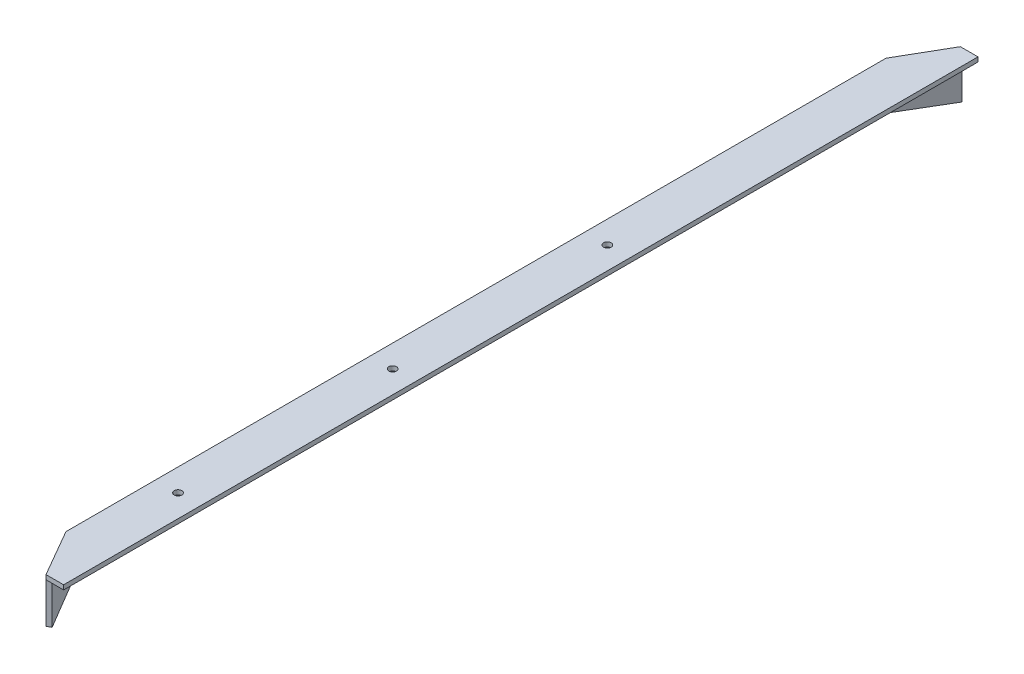
ISO-10303-21;
HEADER;
FILE_DESCRIPTION(('STEP AP214'),'2;1');
FILE_NAME('part.step','',(''),(''),'','','');
FILE_SCHEMA(('AUTOMOTIVE_DESIGN { 1 0 10303 214 1 1 1 1 }'));
ENDSEC;
DATA;
#1=APPLICATION_CONTEXT('core data for automotive mechanical design processes');
#2=APPLICATION_PROTOCOL_DEFINITION('international standard','automotive_design',2000,#1);
#3=PRODUCT_CONTEXT('',#1,'mechanical');
#4=PRODUCT('Part','Part','',(#3));
#5=PRODUCT_RELATED_PRODUCT_CATEGORY('part','',(#4));
#6=PRODUCT_DEFINITION_FORMATION('','',#4);
#7=PRODUCT_DEFINITION_CONTEXT('part definition',#1,'design');
#8=PRODUCT_DEFINITION('design','',#6,#7);
#9=PRODUCT_DEFINITION_SHAPE('','',#8);
#10=(LENGTH_UNIT() NAMED_UNIT(*) SI_UNIT(.MILLI.,.METRE.));
#11=(NAMED_UNIT(*) PLANE_ANGLE_UNIT() SI_UNIT($,.RADIAN.));
#12=(NAMED_UNIT(*) SI_UNIT($,.STERADIAN.) SOLID_ANGLE_UNIT());
#13=UNCERTAINTY_MEASURE_WITH_UNIT(LENGTH_MEASURE(1.E-05),#10,'distance_accuracy_value','');
#14=(GEOMETRIC_REPRESENTATION_CONTEXT(3) GLOBAL_UNCERTAINTY_ASSIGNED_CONTEXT((#13)) GLOBAL_UNIT_ASSIGNED_CONTEXT((#10,
#11,#12)) REPRESENTATION_CONTEXT('',''));
#15=CARTESIAN_POINT('',(0.,0.,0.));
#16=DIRECTION('',(0.,0.,1.));
#17=DIRECTION('',(1.,0.,0.));
#18=AXIS2_PLACEMENT_3D('',#15,#16,#17);
#19=CARTESIAN_POINT('',(7.,0.,640.));
#20=DIRECTION('',(0.,1.,0.));
#21=DIRECTION('',(-1.,0.,0.));
#22=AXIS2_PLACEMENT_3D('',#19,#20,#21);
#23=PLANE('',#22);
#24=DIRECTION('',(0.,0.,-1.));
#25=VECTOR('',#24,1.);
#26=CARTESIAN_POINT('',(0.,0.,640.));
#27=LINE('',#26,#25);
#28=CARTESIAN_POINT('',(0.,0.,640.));
#29=VERTEX_POINT('',#28);
#30=CARTESIAN_POINT('',(0.,0.,-640.));
#31=VERTEX_POINT('',#30);
#32=EDGE_CURVE('E246',#29,#31,#27,.T.);
#33=ORIENTED_EDGE('',*,*,#32,.T.);
#34=DIRECTION('',(0.5,0.,-0.866025403784439));
#35=VECTOR('',#34,1.);
#36=CARTESIAN_POINT('',(0.,0.,-640.));
#37=LINE('',#36,#35);
#38=CARTESIAN_POINT('',(42.5,0.,-713.612159321677));
#39=VERTEX_POINT('',#38);
#40=EDGE_CURVE('E142',#31,#39,#37,.T.);
#41=ORIENTED_EDGE('',*,*,#40,.T.);
#42=DIRECTION('',(0.866025403784443,0.,0.499999999999992));
#43=VECTOR('',#42,1.);
#44=CARTESIAN_POINT('',(42.5,0.,-713.612159321677));
#45=LINE('',#44,#43);
#46=CARTESIAN_POINT('',(48.5621778264911,0.,-710.112159321677));
#47=VERTEX_POINT('',#46);
#48=EDGE_CURVE('E178',#39,#47,#45,.T.);
#49=ORIENTED_EDGE('',*,*,#48,.T.);
#50=DIRECTION('',(-0.509931612811304,0.,0.860214944217817));
#51=VECTOR('',#50,1.);
#52=CARTESIAN_POINT('',(48.5621778264911,0.,-710.112159321677));
#53=LINE('',#52,#51);
#54=CARTESIAN_POINT('',(7.,0.,-640.));
#55=VERTEX_POINT('',#54);
#56=EDGE_CURVE('E170',#47,#55,#53,.T.);
#57=ORIENTED_EDGE('',*,*,#56,.T.);
#58=DIRECTION('',(0.,0.,-1.));
#59=VECTOR('',#58,1.);
#60=CARTESIAN_POINT('',(7.,0.,640.));
#61=LINE('',#60,#59);
#62=CARTESIAN_POINT('',(7.,0.,640.));
#63=VERTEX_POINT('',#62);
#64=EDGE_CURVE('E11',#63,#55,#61,.T.);
#65=ORIENTED_EDGE('',*,*,#64,.F.);
#66=DIRECTION('',(-0.509931612811304,0.,-0.860214944217817));
#67=VECTOR('',#66,1.);
#68=CARTESIAN_POINT('',(48.5621778264911,0.,710.112159321677));
#69=LINE('',#68,#67);
#70=CARTESIAN_POINT('',(48.5621778264911,0.,710.112159321677));
#71=VERTEX_POINT('',#70);
#72=EDGE_CURVE('E220',#71,#63,#69,.T.);
#73=ORIENTED_EDGE('',*,*,#72,.F.);
#74=DIRECTION('',(0.866025403784443,0.,-0.499999999999992));
#75=VECTOR('',#74,1.);
#76=CARTESIAN_POINT('',(42.5,0.,713.612159321677));
#77=LINE('',#76,#75);
#78=CARTESIAN_POINT('',(42.5,0.,713.612159321677));
#79=VERTEX_POINT('',#78);
#80=EDGE_CURVE('E227',#79,#71,#77,.T.);
#81=ORIENTED_EDGE('',*,*,#80,.F.);
#82=DIRECTION('',(0.5,0.,0.866025403784439));
#83=VECTOR('',#82,1.);
#84=CARTESIAN_POINT('',(0.,0.,640.));
#85=LINE('',#84,#83);
#86=EDGE_CURVE('E214',#29,#79,#85,.T.);
#87=ORIENTED_EDGE('',*,*,#86,.F.);
#88=EDGE_LOOP('',(#33,#41,#49,#57,#65,#73,#81,#87));
#89=FACE_BOUND('',#88,.T.);
#90=ADVANCED_FACE('F45',(#89),#23,.F.);
#91=CARTESIAN_POINT('',(6.99999999999999,63.,640.));
#92=DIRECTION('',(-1.,0.,0.));
#93=DIRECTION('',(0.,-1.,0.));
#94=AXIS2_PLACEMENT_3D('',#91,#92,#93);
#95=PLANE('',#94);
#96=ORIENTED_EDGE('',*,*,#64,.T.);
#97=DIRECTION('',(0.,1.,0.));
#98=VECTOR('',#97,1.);
#99=CARTESIAN_POINT('',(6.99999999999999,63.,-640.));
#100=LINE('',#99,#98);
#101=CARTESIAN_POINT('',(6.99999999999999,63.,-640.));
#102=VERTEX_POINT('',#101);
#103=EDGE_CURVE('E190',#55,#102,#100,.T.);
#104=ORIENTED_EDGE('',*,*,#103,.T.);
#105=DIRECTION('',(0.,0.,-1.));
#106=VECTOR('',#105,1.);
#107=CARTESIAN_POINT('',(6.99999999999999,63.,640.));
#108=LINE('',#107,#106);
#109=CARTESIAN_POINT('',(6.99999999999999,63.,640.));
#110=VERTEX_POINT('',#109);
#111=EDGE_CURVE('E54',#110,#102,#108,.T.);
#112=ORIENTED_EDGE('',*,*,#111,.F.);
#113=DIRECTION('',(0.,1.,0.));
#114=VECTOR('',#113,1.);
#115=CARTESIAN_POINT('',(6.99999999999999,63.,640.));
#116=LINE('',#115,#114);
#117=EDGE_CURVE('E240',#63,#110,#116,.T.);
#118=ORIENTED_EDGE('',*,*,#117,.F.);
#119=EDGE_LOOP('',(#96,#104,#112,#118));
#120=FACE_BOUND('',#119,.T.);
#121=ADVANCED_FACE('F306',(#120),#95,.F.);
#122=CARTESIAN_POINT('',(70.,63.,640.));
#123=DIRECTION('',(0.,1.,0.));
#124=DIRECTION('',(-1.,0.,0.));
#125=AXIS2_PLACEMENT_3D('',#122,#123,#124);
#126=PLANE('',#125);
#127=CARTESIAN_POINT('',(35.,63.,500.));
#128=DIRECTION('',(0.,1.,0.));
#129=DIRECTION('',(-1.,0.,0.));
#130=AXIS2_PLACEMENT_3D('',#127,#128,#129);
#131=CIRCLE('',#130,6.);
#132=CARTESIAN_POINT('',(29.,63.,500.));
#133=VERTEX_POINT('',#132);
#134=EDGE_CURVE('E163',#133,#133,#131,.F.);
#135=ORIENTED_EDGE('',*,*,#134,.F.);
#136=EDGE_LOOP('',(#135));
#137=FACE_BOUND('',#136,.T.);
#138=CARTESIAN_POINT('',(35.,63.,165.));
#139=DIRECTION('',(0.,1.,0.));
#140=DIRECTION('',(-1.,0.,0.));
#141=AXIS2_PLACEMENT_3D('',#138,#139,#140);
#142=CIRCLE('',#141,6.);
#143=CARTESIAN_POINT('',(29.,63.,165.));
#144=VERTEX_POINT('',#143);
#145=EDGE_CURVE('E265',#144,#144,#142,.F.);
#146=ORIENTED_EDGE('',*,*,#145,.F.);
#147=EDGE_LOOP('',(#146));
#148=FACE_BOUND('',#147,.T.);
#149=CARTESIAN_POINT('',(35.,63.,-170.));
#150=DIRECTION('',(0.,1.,0.));
#151=DIRECTION('',(-1.,0.,0.));
#152=AXIS2_PLACEMENT_3D('',#149,#150,#151);
#153=CIRCLE('',#152,6.);
#154=CARTESIAN_POINT('',(29.,63.,-170.));
#155=VERTEX_POINT('',#154);
#156=EDGE_CURVE('E261',#155,#155,#153,.F.);
#157=ORIENTED_EDGE('',*,*,#156,.F.);
#158=EDGE_LOOP('',(#157));
#159=FACE_BOUND('',#158,.T.);
#160=ORIENTED_EDGE('',*,*,#111,.T.);
#161=DIRECTION('',(-0.509931612811304,0.,0.860214944217817));
#162=VECTOR('',#161,1.);
#163=CARTESIAN_POINT('',(48.5621778264911,63.,-710.112159321677));
#164=LINE('',#163,#162);
#165=CARTESIAN_POINT('',(48.5621778264911,63.,-710.112159321677));
#166=VERTEX_POINT('',#165);
#167=EDGE_CURVE('E169',#166,#102,#164,.T.);
#168=ORIENTED_EDGE('',*,*,#167,.F.);
#169=DIRECTION('',(0.866025403784443,0.,0.499999999999992));
#170=VECTOR('',#169,1.);
#171=CARTESIAN_POINT('',(42.5,63.,-713.612159321677));
#172=LINE('',#171,#170);
#173=CARTESIAN_POINT('',(42.5,63.,-713.612159321677));
#174=VERTEX_POINT('',#173);
#175=EDGE_CURVE('E165',#174,#166,#172,.T.);
#176=ORIENTED_EDGE('',*,*,#175,.F.);
#177=DIRECTION('',(1.,0.,0.));
#178=VECTOR('',#177,1.);
#179=CARTESIAN_POINT('',(42.5,63.,-713.612159321677));
#180=LINE('',#179,#178);
#181=CARTESIAN_POINT('',(70.,63.,-713.612159321677));
#182=VERTEX_POINT('',#181);
#183=EDGE_CURVE('E138',#174,#182,#180,.T.);
#184=ORIENTED_EDGE('',*,*,#183,.T.);
#185=DIRECTION('',(0.,0.,-1.));
#186=VECTOR('',#185,1.);
#187=CARTESIAN_POINT('',(70.,63.,640.));
#188=LINE('',#187,#186);
#189=CARTESIAN_POINT('',(70.,63.,713.612159321677));
#190=VERTEX_POINT('',#189);
#191=EDGE_CURVE('E253',#190,#182,#188,.T.);
#192=ORIENTED_EDGE('',*,*,#191,.F.);
#193=DIRECTION('',(1.,0.,0.));
#194=VECTOR('',#193,1.);
#195=CARTESIAN_POINT('',(42.5,63.,713.612159321677));
#196=LINE('',#195,#194);
#197=CARTESIAN_POINT('',(42.5,63.,713.612159321677));
#198=VERTEX_POINT('',#197);
#199=EDGE_CURVE('E196',#198,#190,#196,.T.);
#200=ORIENTED_EDGE('',*,*,#199,.F.);
#201=DIRECTION('',(0.866025403784443,0.,-0.499999999999992));
#202=VECTOR('',#201,1.);
#203=CARTESIAN_POINT('',(42.5,63.,713.612159321677));
#204=LINE('',#203,#202);
#205=CARTESIAN_POINT('',(48.5621778264911,63.,710.112159321677));
#206=VERTEX_POINT('',#205);
#207=EDGE_CURVE('E215',#198,#206,#204,.T.);
#208=ORIENTED_EDGE('',*,*,#207,.T.);
#209=DIRECTION('',(-0.509931612811304,0.,-0.860214944217817));
#210=VECTOR('',#209,1.);
#211=CARTESIAN_POINT('',(48.5621778264911,63.,710.112159321677));
#212=LINE('',#211,#210);
#213=EDGE_CURVE('E219',#206,#110,#212,.T.);
#214=ORIENTED_EDGE('',*,*,#213,.T.);
#215=EDGE_LOOP('',(#160,#168,#176,#184,#192,#200,#208,#214));
#216=FACE_BOUND('',#215,.T.);
#217=ADVANCED_FACE('F312',(#137,#148,#159,#216),#126,.F.);
#218=CARTESIAN_POINT('',(70.,70.,640.));
#219=DIRECTION('',(-1.,0.,0.));
#220=DIRECTION('',(0.,0.,1.));
#221=AXIS2_PLACEMENT_3D('',#218,#219,#220);
#222=PLANE('',#221);
#223=ORIENTED_EDGE('',*,*,#191,.T.);
#224=DIRECTION('',(0.,-1.,0.));
#225=VECTOR('',#224,1.);
#226=CARTESIAN_POINT('',(70.,70.,-713.612159321677));
#227=LINE('',#226,#225);
#228=CARTESIAN_POINT('',(70.,70.,-713.612159321677));
#229=VERTEX_POINT('',#228);
#230=EDGE_CURVE('E143',#229,#182,#227,.T.);
#231=ORIENTED_EDGE('',*,*,#230,.F.);
#232=DIRECTION('',(0.,0.,-1.));
#233=VECTOR('',#232,1.);
#234=CARTESIAN_POINT('',(70.,70.,640.));
#235=LINE('',#234,#233);
#236=CARTESIAN_POINT('',(70.,70.,713.612159321677));
#237=VERTEX_POINT('',#236);
#238=EDGE_CURVE('E155',#237,#229,#235,.T.);
#239=ORIENTED_EDGE('',*,*,#238,.F.);
#240=DIRECTION('',(0.,-1.,0.));
#241=VECTOR('',#240,1.);
#242=CARTESIAN_POINT('',(70.,70.,713.612159321677));
#243=LINE('',#242,#241);
#244=EDGE_CURVE('E203',#237,#190,#243,.T.);
#245=ORIENTED_EDGE('',*,*,#244,.T.);
#246=EDGE_LOOP('',(#223,#231,#239,#245));
#247=FACE_BOUND('',#246,.T.);
#248=ADVANCED_FACE('F289',(#247),#222,.F.);
#249=CARTESIAN_POINT('',(0.,70.,640.));
#250=DIRECTION('',(0.,-1.,0.));
#251=DIRECTION('',(0.,0.,-1.));
#252=AXIS2_PLACEMENT_3D('',#249,#250,#251);
#253=PLANE('',#252);
#254=CARTESIAN_POINT('',(35.,70.,500.));
#255=DIRECTION('',(0.,-1.,0.));
#256=DIRECTION('',(0.,0.,-1.));
#257=AXIS2_PLACEMENT_3D('',#254,#255,#256);
#258=CIRCLE('',#257,6.);
#259=CARTESIAN_POINT('',(35.,70.,494.));
#260=VERTEX_POINT('',#259);
#261=EDGE_CURVE('E48',#260,#260,#258,.F.);
#262=ORIENTED_EDGE('',*,*,#261,.F.);
#263=EDGE_LOOP('',(#262));
#264=FACE_BOUND('',#263,.T.);
#265=CARTESIAN_POINT('',(35.,70.,165.));
#266=DIRECTION('',(0.,-1.,0.));
#267=DIRECTION('',(0.,0.,-1.));
#268=AXIS2_PLACEMENT_3D('',#265,#266,#267);
#269=CIRCLE('',#268,6.);
#270=CARTESIAN_POINT('',(35.,70.,159.));
#271=VERTEX_POINT('',#270);
#272=EDGE_CURVE('E262',#271,#271,#269,.F.);
#273=ORIENTED_EDGE('',*,*,#272,.F.);
#274=EDGE_LOOP('',(#273));
#275=FACE_BOUND('',#274,.T.);
#276=CARTESIAN_POINT('',(35.,70.,-170.));
#277=DIRECTION('',(0.,-1.,0.));
#278=DIRECTION('',(0.,0.,-1.));
#279=AXIS2_PLACEMENT_3D('',#276,#277,#278);
#280=CIRCLE('',#279,6.);
#281=CARTESIAN_POINT('',(35.,70.,-176.));
#282=VERTEX_POINT('',#281);
#283=EDGE_CURVE('E258',#282,#282,#280,.F.);
#284=ORIENTED_EDGE('',*,*,#283,.F.);
#285=EDGE_LOOP('',(#284));
#286=FACE_BOUND('',#285,.T.);
#287=ORIENTED_EDGE('',*,*,#238,.T.);
#288=DIRECTION('',(1.,0.,0.));
#289=VECTOR('',#288,1.);
#290=CARTESIAN_POINT('',(42.5,70.,-713.612159321677));
#291=LINE('',#290,#289);
#292=CARTESIAN_POINT('',(42.5,70.,-713.612159321677));
#293=VERTEX_POINT('',#292);
#294=EDGE_CURVE('E135',#293,#229,#291,.T.);
#295=ORIENTED_EDGE('',*,*,#294,.F.);
#296=DIRECTION('',(0.5,0.,-0.866025403784439));
#297=VECTOR('',#296,1.);
#298=CARTESIAN_POINT('',(0.,70.,-640.));
#299=LINE('',#298,#297);
#300=CARTESIAN_POINT('',(0.,70.,-640.));
#301=VERTEX_POINT('',#300);
#302=EDGE_CURVE('E146',#301,#293,#299,.T.);
#303=ORIENTED_EDGE('',*,*,#302,.F.);
#304=DIRECTION('',(0.,0.,-1.));
#305=VECTOR('',#304,1.);
#306=CARTESIAN_POINT('',(0.,70.,640.));
#307=LINE('',#306,#305);
#308=CARTESIAN_POINT('',(0.,70.,640.));
#309=VERTEX_POINT('',#308);
#310=EDGE_CURVE('E70',#309,#301,#307,.T.);
#311=ORIENTED_EDGE('',*,*,#310,.F.);
#312=DIRECTION('',(0.5,0.,0.866025403784439));
#313=VECTOR('',#312,1.);
#314=CARTESIAN_POINT('',(0.,70.,640.));
#315=LINE('',#314,#313);
#316=CARTESIAN_POINT('',(42.5,70.,713.612159321677));
#317=VERTEX_POINT('',#316);
#318=EDGE_CURVE('E197',#309,#317,#315,.T.);
#319=ORIENTED_EDGE('',*,*,#318,.T.);
#320=DIRECTION('',(1.,0.,0.));
#321=VECTOR('',#320,1.);
#322=CARTESIAN_POINT('',(42.5,70.,713.612159321677));
#323=LINE('',#322,#321);
#324=EDGE_CURVE('E200',#317,#237,#323,.T.);
#325=ORIENTED_EDGE('',*,*,#324,.T.);
#326=EDGE_LOOP('',(#287,#295,#303,#311,#319,#325));
#327=FACE_BOUND('',#326,.T.);
#328=ADVANCED_FACE('F153',(#264,#275,#286,#327),#253,.F.);
#329=CARTESIAN_POINT('',(0.,0.,640.));
#330=DIRECTION('',(1.,0.,0.));
#331=DIRECTION('',(0.,0.,-1.));
#332=AXIS2_PLACEMENT_3D('',#329,#330,#331);
#333=PLANE('',#332);
#334=ORIENTED_EDGE('',*,*,#310,.T.);
#335=DIRECTION('',(0.,-1.,0.));
#336=VECTOR('',#335,1.);
#337=CARTESIAN_POINT('',(0.,0.,-640.));
#338=LINE('',#337,#336);
#339=EDGE_CURVE('E150',#301,#31,#338,.T.);
#340=ORIENTED_EDGE('',*,*,#339,.T.);
#341=ORIENTED_EDGE('',*,*,#32,.F.);
#342=DIRECTION('',(0.,-1.,0.));
#343=VECTOR('',#342,1.);
#344=CARTESIAN_POINT('',(0.,0.,640.));
#345=LINE('',#344,#343);
#346=EDGE_CURVE('E62',#309,#29,#345,.T.);
#347=ORIENTED_EDGE('',*,*,#346,.F.);
#348=EDGE_LOOP('',(#334,#340,#341,#347));
#349=FACE_BOUND('',#348,.T.);
#350=ADVANCED_FACE('F288',(#349),#333,.F.);
#351=CARTESIAN_POINT('',(0.,63.,640.));
#352=DIRECTION('',(0.866025403784439,0.,-0.5));
#353=DIRECTION('',(-0.5,0.,-0.866025403784439));
#354=AXIS2_PLACEMENT_3D('',#351,#352,#353);
#355=PLANE('',#354);
#356=ORIENTED_EDGE('',*,*,#86,.T.);
#357=DIRECTION('',(0.,-1.,0.));
#358=VECTOR('',#357,1.);
#359=CARTESIAN_POINT('',(42.5,63.,713.612159321677));
#360=LINE('',#359,#358);
#361=EDGE_CURVE('E236',#198,#79,#360,.T.);
#362=ORIENTED_EDGE('',*,*,#361,.F.);
#363=DIRECTION('',(0.,-1.,0.));
#364=VECTOR('',#363,1.);
#365=CARTESIAN_POINT('',(42.5,70.,713.612159321677));
#366=LINE('',#365,#364);
#367=EDGE_CURVE('E210',#317,#198,#366,.T.);
#368=ORIENTED_EDGE('',*,*,#367,.F.);
#369=ORIENTED_EDGE('',*,*,#318,.F.);
#370=ORIENTED_EDGE('',*,*,#346,.T.);
#371=EDGE_LOOP('',(#356,#362,#368,#369,#370));
#372=FACE_BOUND('',#371,.T.);
#373=ADVANCED_FACE('F335',(#372),#355,.F.);
#374=CARTESIAN_POINT('',(42.5,63.,713.612159321677));
#375=DIRECTION('',(-0.499999999999992,0.,-0.866025403784443));
#376=DIRECTION('',(-0.866025403784443,0.,0.499999999999992));
#377=AXIS2_PLACEMENT_3D('',#374,#375,#376);
#378=PLANE('',#377);
#379=ORIENTED_EDGE('',*,*,#80,.T.);
#380=DIRECTION('',(0.,-1.,0.));
#381=VECTOR('',#380,1.);
#382=CARTESIAN_POINT('',(48.5621778264911,63.,710.112159321677));
#383=LINE('',#382,#381);
#384=EDGE_CURVE('E224',#206,#71,#383,.T.);
#385=ORIENTED_EDGE('',*,*,#384,.F.);
#386=ORIENTED_EDGE('',*,*,#207,.F.);
#387=ORIENTED_EDGE('',*,*,#361,.T.);
#388=EDGE_LOOP('',(#379,#385,#386,#387));
#389=FACE_BOUND('',#388,.T.);
#390=ADVANCED_FACE('F333',(#389),#378,.F.);
#391=CARTESIAN_POINT('',(48.5621778264911,63.,710.112159321677));
#392=DIRECTION('',(-0.860214944217817,0.,0.509931612811304));
#393=DIRECTION('',(0.509931612811304,0.,0.860214944217817));
#394=AXIS2_PLACEMENT_3D('',#391,#392,#393);
#395=PLANE('',#394);
#396=ORIENTED_EDGE('',*,*,#72,.T.);
#397=ORIENTED_EDGE('',*,*,#117,.T.);
#398=ORIENTED_EDGE('',*,*,#213,.F.);
#399=ORIENTED_EDGE('',*,*,#384,.T.);
#400=EDGE_LOOP('',(#396,#397,#398,#399));
#401=FACE_BOUND('',#400,.T.);
#402=ADVANCED_FACE('F328',(#401),#395,.F.);
#403=CARTESIAN_POINT('',(42.5,70.,713.612159321677));
#404=DIRECTION('',(0.,0.,-1.));
#405=DIRECTION('',(-1.,0.,0.));
#406=AXIS2_PLACEMENT_3D('',#403,#404,#405);
#407=PLANE('',#406);
#408=ORIENTED_EDGE('',*,*,#199,.T.);
#409=ORIENTED_EDGE('',*,*,#244,.F.);
#410=ORIENTED_EDGE('',*,*,#324,.F.);
#411=ORIENTED_EDGE('',*,*,#367,.T.);
#412=EDGE_LOOP('',(#408,#409,#410,#411));
#413=FACE_BOUND('',#412,.T.);
#414=ADVANCED_FACE('F338',(#413),#407,.F.);
#415=CARTESIAN_POINT('',(0.,63.,-640.));
#416=DIRECTION('',(0.866025403784439,0.,0.5));
#417=DIRECTION('',(-0.5,0.,0.866025403784439));
#418=AXIS2_PLACEMENT_3D('',#415,#416,#417);
#419=PLANE('',#418);
#420=ORIENTED_EDGE('',*,*,#40,.F.);
#421=ORIENTED_EDGE('',*,*,#339,.F.);
#422=ORIENTED_EDGE('',*,*,#302,.T.);
#423=DIRECTION('',(0.,-1.,0.));
#424=VECTOR('',#423,1.);
#425=CARTESIAN_POINT('',(42.5,70.,-713.612159321677));
#426=LINE('',#425,#424);
#427=EDGE_CURVE('E130',#293,#174,#426,.T.);
#428=ORIENTED_EDGE('',*,*,#427,.T.);
#429=DIRECTION('',(0.,-1.,0.));
#430=VECTOR('',#429,1.);
#431=CARTESIAN_POINT('',(42.5,63.,-713.612159321677));
#432=LINE('',#431,#430);
#433=EDGE_CURVE('E187',#174,#39,#432,.T.);
#434=ORIENTED_EDGE('',*,*,#433,.T.);
#435=EDGE_LOOP('',(#420,#421,#422,#428,#434));
#436=FACE_BOUND('',#435,.T.);
#437=ADVANCED_FACE('F148',(#436),#419,.F.);
#438=CARTESIAN_POINT('',(42.5,63.,-713.612159321677));
#439=DIRECTION('',(-0.499999999999992,0.,0.866025403784443));
#440=DIRECTION('',(-0.866025403784443,0.,-0.499999999999992));
#441=AXIS2_PLACEMENT_3D('',#438,#439,#440);
#442=PLANE('',#441);
#443=ORIENTED_EDGE('',*,*,#48,.F.);
#444=ORIENTED_EDGE('',*,*,#433,.F.);
#445=ORIENTED_EDGE('',*,*,#175,.T.);
#446=DIRECTION('',(0.,-1.,0.));
#447=VECTOR('',#446,1.);
#448=CARTESIAN_POINT('',(48.5621778264911,63.,-710.112159321677));
#449=LINE('',#448,#447);
#450=EDGE_CURVE('E174',#166,#47,#449,.T.);
#451=ORIENTED_EDGE('',*,*,#450,.T.);
#452=EDGE_LOOP('',(#443,#444,#445,#451));
#453=FACE_BOUND('',#452,.T.);
#454=ADVANCED_FACE('F319',(#453),#442,.F.);
#455=CARTESIAN_POINT('',(48.5621778264911,63.,-710.112159321677));
#456=DIRECTION('',(-0.860214944217817,0.,-0.509931612811304));
#457=DIRECTION('',(0.509931612811304,0.,-0.860214944217817));
#458=AXIS2_PLACEMENT_3D('',#455,#456,#457);
#459=PLANE('',#458);
#460=ORIENTED_EDGE('',*,*,#56,.F.);
#461=ORIENTED_EDGE('',*,*,#450,.F.);
#462=ORIENTED_EDGE('',*,*,#167,.T.);
#463=ORIENTED_EDGE('',*,*,#103,.F.);
#464=EDGE_LOOP('',(#460,#461,#462,#463));
#465=FACE_BOUND('',#464,.T.);
#466=ADVANCED_FACE('F303',(#465),#459,.F.);
#467=CARTESIAN_POINT('',(42.5,70.,-713.612159321677));
#468=DIRECTION('',(0.,0.,1.));
#469=DIRECTION('',(-1.,0.,0.));
#470=AXIS2_PLACEMENT_3D('',#467,#468,#469);
#471=PLANE('',#470);
#472=ORIENTED_EDGE('',*,*,#183,.F.);
#473=ORIENTED_EDGE('',*,*,#427,.F.);
#474=ORIENTED_EDGE('',*,*,#294,.T.);
#475=ORIENTED_EDGE('',*,*,#230,.T.);
#476=EDGE_LOOP('',(#472,#473,#474,#475));
#477=FACE_BOUND('',#476,.T.);
#478=ADVANCED_FACE('F132',(#477),#471,.F.);
#479=CARTESIAN_POINT('',(35.,80.,-170.));
#480=DIRECTION('',(0.,-1.,0.));
#481=DIRECTION('',(0.,0.,-1.));
#482=AXIS2_PLACEMENT_3D('',#479,#480,#481);
#483=CYLINDRICAL_SURFACE('',#482,6.);
#484=ORIENTED_EDGE('',*,*,#283,.T.);
#485=EDGE_LOOP('',(#484));
#486=FACE_BOUND('',#485,.T.);
#487=ORIENTED_EDGE('',*,*,#156,.T.);
#488=EDGE_LOOP('',(#487));
#489=FACE_BOUND('',#488,.T.);
#490=ADVANCED_FACE('F294',(#486,#489),#483,.F.);
#491=CARTESIAN_POINT('',(35.,80.,165.));
#492=DIRECTION('',(0.,-1.,0.));
#493=DIRECTION('',(0.,0.,-1.));
#494=AXIS2_PLACEMENT_3D('',#491,#492,#493);
#495=CYLINDRICAL_SURFACE('',#494,6.);
#496=ORIENTED_EDGE('',*,*,#272,.T.);
#497=EDGE_LOOP('',(#496));
#498=FACE_BOUND('',#497,.T.);
#499=ORIENTED_EDGE('',*,*,#145,.T.);
#500=EDGE_LOOP('',(#499));
#501=FACE_BOUND('',#500,.T.);
#502=ADVANCED_FACE('F296',(#498,#501),#495,.F.);
#503=CARTESIAN_POINT('',(35.,80.,500.));
#504=DIRECTION('',(0.,-1.,0.));
#505=DIRECTION('',(0.,0.,-1.));
#506=AXIS2_PLACEMENT_3D('',#503,#504,#505);
#507=CYLINDRICAL_SURFACE('',#506,6.);
#508=ORIENTED_EDGE('',*,*,#261,.T.);
#509=EDGE_LOOP('',(#508));
#510=FACE_BOUND('',#509,.T.);
#511=ORIENTED_EDGE('',*,*,#134,.T.);
#512=EDGE_LOOP('',(#511));
#513=FACE_BOUND('',#512,.T.);
#514=ADVANCED_FACE('F284',(#510,#513),#507,.F.);
#515=CLOSED_SHELL('',(#90,#121,#217,#248,#328,#350,#373,#390,#402,#414,#437,#454,#466,#478,#490,
#502,#514));
#516=MANIFOLD_SOLID_BREP('B2',#515);
#517=ADVANCED_BREP_SHAPE_REPRESENTATION('',(#18,#516),#14);
#518=SHAPE_DEFINITION_REPRESENTATION(#9,#517);
ENDSEC;
END-ISO-10303-21;
